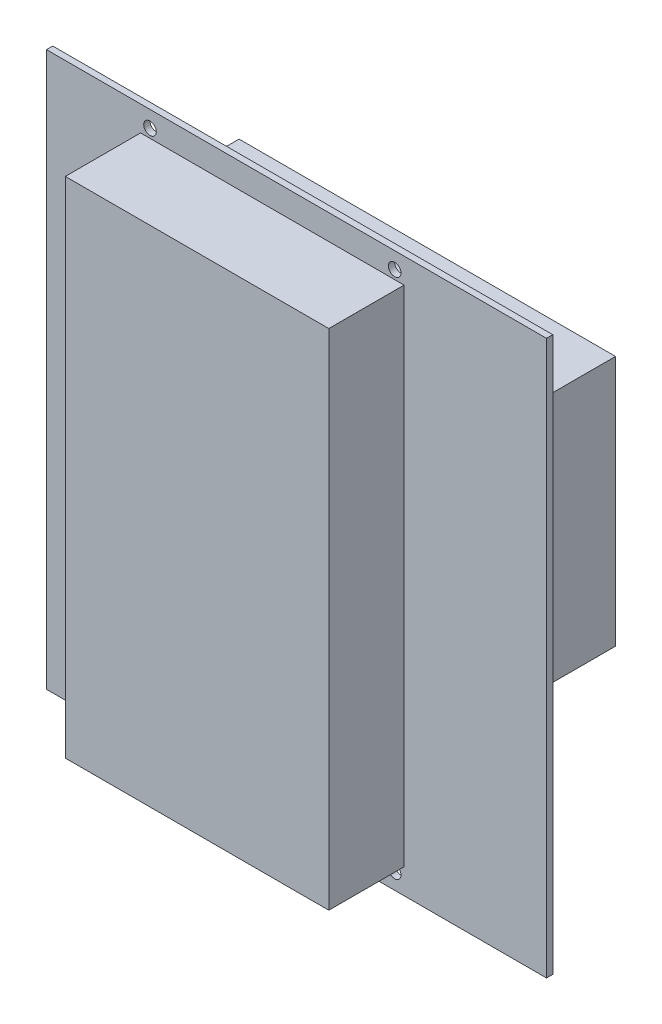
ISO-10303-21;
HEADER;
FILE_DESCRIPTION(('STEP AP214'),'2;1');
FILE_NAME('part.step','',(''),(''),'','','');
FILE_SCHEMA(('AUTOMOTIVE_DESIGN { 1 0 10303 214 1 1 1 1 }'));
ENDSEC;
DATA;
#1=APPLICATION_CONTEXT('core data for automotive mechanical design processes');
#2=APPLICATION_PROTOCOL_DEFINITION('international standard','automotive_design',2000,#1);
#3=PRODUCT_CONTEXT('',#1,'mechanical');
#4=PRODUCT('Part','Part','',(#3));
#5=PRODUCT_RELATED_PRODUCT_CATEGORY('part','',(#4));
#6=PRODUCT_DEFINITION_FORMATION('','',#4);
#7=PRODUCT_DEFINITION_CONTEXT('part definition',#1,'design');
#8=PRODUCT_DEFINITION('design','',#6,#7);
#9=PRODUCT_DEFINITION_SHAPE('','',#8);
#10=(LENGTH_UNIT() NAMED_UNIT(*) SI_UNIT(.MILLI.,.METRE.));
#11=(NAMED_UNIT(*) PLANE_ANGLE_UNIT() SI_UNIT($,.RADIAN.));
#12=(NAMED_UNIT(*) SI_UNIT($,.STERADIAN.) SOLID_ANGLE_UNIT());
#13=UNCERTAINTY_MEASURE_WITH_UNIT(LENGTH_MEASURE(1.E-05),#10,'distance_accuracy_value','');
#14=(GEOMETRIC_REPRESENTATION_CONTEXT(3) GLOBAL_UNCERTAINTY_ASSIGNED_CONTEXT((#13)) GLOBAL_UNIT_ASSIGNED_CONTEXT((#10,
#11,#12)) REPRESENTATION_CONTEXT('',''));
#15=CARTESIAN_POINT('',(0.,0.,0.));
#16=DIRECTION('',(0.,0.,1.));
#17=DIRECTION('',(1.,0.,0.));
#18=AXIS2_PLACEMENT_3D('',#15,#16,#17);
#19=CARTESIAN_POINT('',(0.,0.,0.));
#20=DIRECTION('',(0.,0.,-1.));
#21=DIRECTION('',(-1.,0.,0.));
#22=AXIS2_PLACEMENT_3D('',#19,#20,#21);
#23=PLANE('',#22);
#24=CARTESIAN_POINT('',(19.8755,-52.7685,0.));
#25=DIRECTION('',(0.,0.,-1.));
#26=DIRECTION('',(-1.,0.,0.));
#27=AXIS2_PLACEMENT_3D('',#24,#25,#26);
#28=CIRCLE('',#27,1.27);
#29=CARTESIAN_POINT('',(18.6055,-52.7685,0.));
#30=VERTEX_POINT('',#29);
#31=EDGE_CURVE('E221',#30,#30,#28,.T.);
#32=ORIENTED_EDGE('',*,*,#31,.F.);
#33=EDGE_LOOP('',(#32));
#34=FACE_BOUND('',#33,.T.);
#35=CARTESIAN_POINT('',(-29.6545,-52.7685,0.));
#36=DIRECTION('',(0.,0.,-1.));
#37=DIRECTION('',(-1.,0.,0.));
#38=AXIS2_PLACEMENT_3D('',#35,#36,#37);
#39=CIRCLE('',#38,1.27);
#40=CARTESIAN_POINT('',(-30.9245,-52.7685,0.));
#41=VERTEX_POINT('',#40);
#42=EDGE_CURVE('E218',#41,#41,#39,.T.);
#43=ORIENTED_EDGE('',*,*,#42,.F.);
#44=EDGE_LOOP('',(#43));
#45=FACE_BOUND('',#44,.T.);
#46=CARTESIAN_POINT('',(19.8755,52.7685,0.));
#47=DIRECTION('',(0.,0.,-1.));
#48=DIRECTION('',(-1.,0.,0.));
#49=AXIS2_PLACEMENT_3D('',#46,#47,#48);
#50=CIRCLE('',#49,1.27);
#51=CARTESIAN_POINT('',(18.6055,52.7685,0.));
#52=VERTEX_POINT('',#51);
#53=EDGE_CURVE('E215',#52,#52,#50,.T.);
#54=ORIENTED_EDGE('',*,*,#53,.F.);
#55=EDGE_LOOP('',(#54));
#56=FACE_BOUND('',#55,.T.);
#57=CARTESIAN_POINT('',(-29.6545,52.7685,0.));
#58=DIRECTION('',(0.,0.,-1.));
#59=DIRECTION('',(-1.,0.,0.));
#60=AXIS2_PLACEMENT_3D('',#57,#58,#59);
#61=CIRCLE('',#60,1.27);
#62=CARTESIAN_POINT('',(-30.9245,52.7685,0.));
#63=VERTEX_POINT('',#62);
#64=EDGE_CURVE('E214',#63,#63,#61,.T.);
#65=ORIENTED_EDGE('',*,*,#64,.F.);
#66=EDGE_LOOP('',(#65));
#67=FACE_BOUND('',#66,.T.);
#68=DIRECTION('',(0.,1.,0.));
#69=VECTOR('',#68,1.);
#70=CARTESIAN_POINT('',(-50.6095,-56.0705,0.));
#71=LINE('',#70,#69);
#72=CARTESIAN_POINT('',(-50.6095,-56.0705,0.));
#73=VERTEX_POINT('',#72);
#74=CARTESIAN_POINT('',(-50.6095,56.0705,0.));
#75=VERTEX_POINT('',#74);
#76=EDGE_CURVE('E182',#73,#75,#71,.T.);
#77=ORIENTED_EDGE('',*,*,#76,.T.);
#78=DIRECTION('',(1.,0.,0.));
#79=VECTOR('',#78,1.);
#80=CARTESIAN_POINT('',(-50.6095,56.0705,0.));
#81=LINE('',#80,#79);
#82=CARTESIAN_POINT('',(50.6095,56.0705,0.));
#83=VERTEX_POINT('',#82);
#84=EDGE_CURVE('E199',#75,#83,#81,.T.);
#85=ORIENTED_EDGE('',*,*,#84,.T.);
#86=DIRECTION('',(0.,-1.,0.));
#87=VECTOR('',#86,1.);
#88=CARTESIAN_POINT('',(50.6095,56.0705,0.));
#89=LINE('',#88,#87);
#90=CARTESIAN_POINT('',(50.6095,-56.0705,0.));
#91=VERTEX_POINT('',#90);
#92=EDGE_CURVE('E202',#83,#91,#89,.T.);
#93=ORIENTED_EDGE('',*,*,#92,.T.);
#94=DIRECTION('',(-1.,0.,0.));
#95=VECTOR('',#94,1.);
#96=CARTESIAN_POINT('',(50.6095,-56.0705,0.));
#97=LINE('',#96,#95);
#98=EDGE_CURVE('E187',#91,#73,#97,.T.);
#99=ORIENTED_EDGE('',*,*,#98,.T.);
#100=EDGE_LOOP('',(#77,#85,#93,#99));
#101=FACE_BOUND('',#100,.T.);
#102=DIRECTION('',(-1.,0.,0.));
#103=VECTOR('',#102,1.);
#104=CARTESIAN_POINT('',(41.7195,-13.7795,0.));
#105=LINE('',#104,#103);
#106=CARTESIAN_POINT('',(41.7195,-13.7795,0.));
#107=VERTEX_POINT('',#106);
#108=CARTESIAN_POINT('',(-34.4805,-13.7795,0.));
#109=VERTEX_POINT('',#108);
#110=EDGE_CURVE('E240',#107,#109,#105,.T.);
#111=ORIENTED_EDGE('',*,*,#110,.F.);
#112=DIRECTION('',(0.,-1.,0.));
#113=VECTOR('',#112,1.);
#114=CARTESIAN_POINT('',(41.7195,37.0205,0.));
#115=LINE('',#114,#113);
#116=CARTESIAN_POINT('',(41.7195,37.0205,0.));
#117=VERTEX_POINT('',#116);
#118=EDGE_CURVE('E146',#117,#107,#115,.T.);
#119=ORIENTED_EDGE('',*,*,#118,.F.);
#120=DIRECTION('',(1.,0.,0.));
#121=VECTOR('',#120,1.);
#122=CARTESIAN_POINT('',(41.7195,37.0205,0.));
#123=LINE('',#122,#121);
#124=CARTESIAN_POINT('',(-34.4805,37.0205,0.));
#125=VERTEX_POINT('',#124);
#126=EDGE_CURVE('E142',#125,#117,#123,.T.);
#127=ORIENTED_EDGE('',*,*,#126,.F.);
#128=DIRECTION('',(0.,1.,0.));
#129=VECTOR('',#128,1.);
#130=CARTESIAN_POINT('',(-34.4805,37.0205,0.));
#131=LINE('',#130,#129);
#132=EDGE_CURVE('E242',#109,#125,#131,.T.);
#133=ORIENTED_EDGE('',*,*,#132,.F.);
#134=EDGE_LOOP('',(#111,#119,#127,#133));
#135=FACE_BOUND('',#134,.T.);
#136=ADVANCED_FACE('F33',(#34,#45,#56,#67,#101,#135),#23,.T.);
#137=CARTESIAN_POINT('',(0.,0.,1.27));
#138=DIRECTION('',(0.,0.,-1.));
#139=DIRECTION('',(-1.,0.,0.));
#140=AXIS2_PLACEMENT_3D('',#137,#138,#139);
#141=PLANE('',#140);
#142=CARTESIAN_POINT('',(19.8755,-52.7685,1.27));
#143=DIRECTION('',(0.,0.,-1.));
#144=DIRECTION('',(-1.,0.,0.));
#145=AXIS2_PLACEMENT_3D('',#142,#143,#144);
#146=CIRCLE('',#145,1.27);
#147=CARTESIAN_POINT('',(18.6055,-52.7685,1.27));
#148=VERTEX_POINT('',#147);
#149=EDGE_CURVE('E37',#148,#148,#146,.T.);
#150=ORIENTED_EDGE('',*,*,#149,.T.);
#151=EDGE_LOOP('',(#150));
#152=FACE_BOUND('',#151,.T.);
#153=CARTESIAN_POINT('',(-29.6545,-52.7685,1.27));
#154=DIRECTION('',(0.,0.,-1.));
#155=DIRECTION('',(-1.,0.,0.));
#156=AXIS2_PLACEMENT_3D('',#153,#154,#155);
#157=CIRCLE('',#156,1.27);
#158=CARTESIAN_POINT('',(-30.9245,-52.7685,1.27));
#159=VERTEX_POINT('',#158);
#160=EDGE_CURVE('E219',#159,#159,#157,.T.);
#161=ORIENTED_EDGE('',*,*,#160,.T.);
#162=EDGE_LOOP('',(#161));
#163=FACE_BOUND('',#162,.T.);
#164=CARTESIAN_POINT('',(19.8755,52.7685,1.27));
#165=DIRECTION('',(0.,0.,-1.));
#166=DIRECTION('',(-1.,0.,0.));
#167=AXIS2_PLACEMENT_3D('',#164,#165,#166);
#168=CIRCLE('',#167,1.27);
#169=CARTESIAN_POINT('',(18.6055,52.7685,1.27));
#170=VERTEX_POINT('',#169);
#171=EDGE_CURVE('E216',#170,#170,#168,.T.);
#172=ORIENTED_EDGE('',*,*,#171,.T.);
#173=EDGE_LOOP('',(#172));
#174=FACE_BOUND('',#173,.T.);
#175=CARTESIAN_POINT('',(-29.6545,52.7685,1.27));
#176=DIRECTION('',(0.,0.,-1.));
#177=DIRECTION('',(-1.,0.,0.));
#178=AXIS2_PLACEMENT_3D('',#175,#176,#177);
#179=CIRCLE('',#178,1.27);
#180=CARTESIAN_POINT('',(-30.9245,52.7685,1.27));
#181=VERTEX_POINT('',#180);
#182=EDGE_CURVE('E211',#181,#181,#179,.T.);
#183=ORIENTED_EDGE('',*,*,#182,.T.);
#184=EDGE_LOOP('',(#183));
#185=FACE_BOUND('',#184,.T.);
#186=DIRECTION('',(0.,1.,0.));
#187=VECTOR('',#186,1.);
#188=CARTESIAN_POINT('',(-50.6095,-56.0705,1.27));
#189=LINE('',#188,#187);
#190=CARTESIAN_POINT('',(-50.6095,-56.0705,1.27));
#191=VERTEX_POINT('',#190);
#192=CARTESIAN_POINT('',(-50.6095,56.0705,1.27));
#193=VERTEX_POINT('',#192);
#194=EDGE_CURVE('E183',#191,#193,#189,.T.);
#195=ORIENTED_EDGE('',*,*,#194,.F.);
#196=DIRECTION('',(-1.,0.,0.));
#197=VECTOR('',#196,1.);
#198=CARTESIAN_POINT('',(50.6095,-56.0705,1.27));
#199=LINE('',#198,#197);
#200=CARTESIAN_POINT('',(50.6095,-56.0705,1.27));
#201=VERTEX_POINT('',#200);
#202=EDGE_CURVE('E193',#201,#191,#199,.T.);
#203=ORIENTED_EDGE('',*,*,#202,.F.);
#204=DIRECTION('',(0.,-1.,0.));
#205=VECTOR('',#204,1.);
#206=CARTESIAN_POINT('',(50.6095,56.0705,1.27));
#207=LINE('',#206,#205);
#208=CARTESIAN_POINT('',(50.6095,56.0705,1.27));
#209=VERTEX_POINT('',#208);
#210=EDGE_CURVE('E190',#209,#201,#207,.T.);
#211=ORIENTED_EDGE('',*,*,#210,.F.);
#212=DIRECTION('',(1.,0.,0.));
#213=VECTOR('',#212,1.);
#214=CARTESIAN_POINT('',(-50.6095,56.0705,1.27));
#215=LINE('',#214,#213);
#216=EDGE_CURVE('E186',#193,#209,#215,.T.);
#217=ORIENTED_EDGE('',*,*,#216,.F.);
#218=EDGE_LOOP('',(#195,#203,#211,#217));
#219=FACE_BOUND('',#218,.T.);
#220=DIRECTION('',(0.,-1.,0.));
#221=VECTOR('',#220,1.);
#222=CARTESIAN_POINT('',(-31.5595,-50.9905,1.27));
#223=LINE('',#222,#221);
#224=CARTESIAN_POINT('',(-31.5595,50.9905,1.27));
#225=VERTEX_POINT('',#224);
#226=CARTESIAN_POINT('',(-31.5595,-50.9905,1.27));
#227=VERTEX_POINT('',#226);
#228=EDGE_CURVE('E148',#225,#227,#223,.T.);
#229=ORIENTED_EDGE('',*,*,#228,.F.);
#230=DIRECTION('',(-1.,0.,0.));
#231=VECTOR('',#230,1.);
#232=CARTESIAN_POINT('',(-31.5595,50.9905,1.27));
#233=LINE('',#232,#231);
#234=CARTESIAN_POINT('',(21.7805,50.9905,1.27));
#235=VERTEX_POINT('',#234);
#236=EDGE_CURVE('E159',#235,#225,#233,.T.);
#237=ORIENTED_EDGE('',*,*,#236,.F.);
#238=DIRECTION('',(0.,1.,0.));
#239=VECTOR('',#238,1.);
#240=CARTESIAN_POINT('',(21.7805,50.9905,1.27));
#241=LINE('',#240,#239);
#242=CARTESIAN_POINT('',(21.7805,-50.9905,1.27));
#243=VERTEX_POINT('',#242);
#244=EDGE_CURVE('E167',#243,#235,#241,.T.);
#245=ORIENTED_EDGE('',*,*,#244,.F.);
#246=DIRECTION('',(1.,0.,0.));
#247=VECTOR('',#246,1.);
#248=CARTESIAN_POINT('',(21.7805,-50.9905,1.27));
#249=LINE('',#248,#247);
#250=EDGE_CURVE('E58',#227,#243,#249,.T.);
#251=ORIENTED_EDGE('',*,*,#250,.F.);
#252=EDGE_LOOP('',(#229,#237,#245,#251));
#253=FACE_BOUND('',#252,.T.);
#254=ADVANCED_FACE('F261',(#152,#163,#174,#185,#219,#253),#141,.F.);
#255=CARTESIAN_POINT('',(-50.6095,-56.0705,1.27));
#256=DIRECTION('',(-1.,0.,0.));
#257=DIRECTION('',(0.,0.,1.));
#258=AXIS2_PLACEMENT_3D('',#255,#256,#257);
#259=PLANE('',#258);
#260=ORIENTED_EDGE('',*,*,#76,.F.);
#261=DIRECTION('',(0.,0.,-1.));
#262=VECTOR('',#261,1.);
#263=CARTESIAN_POINT('',(-50.6095,-56.0705,1.27));
#264=LINE('',#263,#262);
#265=EDGE_CURVE('E11',#191,#73,#264,.T.);
#266=ORIENTED_EDGE('',*,*,#265,.F.);
#267=ORIENTED_EDGE('',*,*,#194,.T.);
#268=DIRECTION('',(0.,0.,-1.));
#269=VECTOR('',#268,1.);
#270=CARTESIAN_POINT('',(-50.6095,56.0705,1.27));
#271=LINE('',#270,#269);
#272=EDGE_CURVE('E196',#193,#75,#271,.T.);
#273=ORIENTED_EDGE('',*,*,#272,.T.);
#274=EDGE_LOOP('',(#260,#266,#267,#273));
#275=FACE_BOUND('',#274,.T.);
#276=ADVANCED_FACE('F35',(#275),#259,.T.);
#277=CARTESIAN_POINT('',(50.6095,-56.0705,1.27));
#278=DIRECTION('',(0.,-1.,0.));
#279=DIRECTION('',(1.,0.,0.));
#280=AXIS2_PLACEMENT_3D('',#277,#278,#279);
#281=PLANE('',#280);
#282=ORIENTED_EDGE('',*,*,#98,.F.);
#283=DIRECTION('',(0.,0.,-1.));
#284=VECTOR('',#283,1.);
#285=CARTESIAN_POINT('',(50.6095,-56.0705,1.27));
#286=LINE('',#285,#284);
#287=EDGE_CURVE('E42',#201,#91,#286,.T.);
#288=ORIENTED_EDGE('',*,*,#287,.F.);
#289=ORIENTED_EDGE('',*,*,#202,.T.);
#290=ORIENTED_EDGE('',*,*,#265,.T.);
#291=EDGE_LOOP('',(#282,#288,#289,#290));
#292=FACE_BOUND('',#291,.T.);
#293=ADVANCED_FACE('F272',(#292),#281,.T.);
#294=CARTESIAN_POINT('',(50.6095,56.0705,1.27));
#295=DIRECTION('',(1.,0.,0.));
#296=DIRECTION('',(0.,1.,0.));
#297=AXIS2_PLACEMENT_3D('',#294,#295,#296);
#298=PLANE('',#297);
#299=ORIENTED_EDGE('',*,*,#92,.F.);
#300=DIRECTION('',(0.,0.,-1.));
#301=VECTOR('',#300,1.);
#302=CARTESIAN_POINT('',(50.6095,56.0705,1.27));
#303=LINE('',#302,#301);
#304=EDGE_CURVE('E208',#209,#83,#303,.T.);
#305=ORIENTED_EDGE('',*,*,#304,.F.);
#306=ORIENTED_EDGE('',*,*,#210,.T.);
#307=ORIENTED_EDGE('',*,*,#287,.T.);
#308=EDGE_LOOP('',(#299,#305,#306,#307));
#309=FACE_BOUND('',#308,.T.);
#310=ADVANCED_FACE('F275',(#309),#298,.T.);
#311=CARTESIAN_POINT('',(-50.6095,56.0705,1.27));
#312=DIRECTION('',(0.,1.,0.));
#313=DIRECTION('',(-1.,0.,0.));
#314=AXIS2_PLACEMENT_3D('',#311,#312,#313);
#315=PLANE('',#314);
#316=ORIENTED_EDGE('',*,*,#84,.F.);
#317=ORIENTED_EDGE('',*,*,#272,.F.);
#318=ORIENTED_EDGE('',*,*,#216,.T.);
#319=ORIENTED_EDGE('',*,*,#304,.T.);
#320=EDGE_LOOP('',(#316,#317,#318,#319));
#321=FACE_BOUND('',#320,.T.);
#322=ADVANCED_FACE('F278',(#321),#315,.T.);
#323=CARTESIAN_POINT('',(-31.5595,-50.9905,16.51));
#324=DIRECTION('',(1.,0.,0.));
#325=DIRECTION('',(0.,0.,-1.));
#326=AXIS2_PLACEMENT_3D('',#323,#324,#325);
#327=PLANE('',#326);
#328=ORIENTED_EDGE('',*,*,#228,.T.);
#329=DIRECTION('',(0.,0.,-1.));
#330=VECTOR('',#329,1.);
#331=CARTESIAN_POINT('',(-31.5595,-50.9905,16.51));
#332=LINE('',#331,#330);
#333=CARTESIAN_POINT('',(-31.5595,-50.9905,16.51));
#334=VERTEX_POINT('',#333);
#335=EDGE_CURVE('E180',#334,#227,#332,.T.);
#336=ORIENTED_EDGE('',*,*,#335,.F.);
#337=DIRECTION('',(0.,-1.,0.));
#338=VECTOR('',#337,1.);
#339=CARTESIAN_POINT('',(-31.5595,-50.9905,16.51));
#340=LINE('',#339,#338);
#341=CARTESIAN_POINT('',(-31.5595,50.9905,16.51));
#342=VERTEX_POINT('',#341);
#343=EDGE_CURVE('E155',#342,#334,#340,.T.);
#344=ORIENTED_EDGE('',*,*,#343,.F.);
#345=DIRECTION('',(0.,0.,-1.));
#346=VECTOR('',#345,1.);
#347=CARTESIAN_POINT('',(-31.5595,50.9905,16.51));
#348=LINE('',#347,#346);
#349=EDGE_CURVE('E164',#342,#225,#348,.T.);
#350=ORIENTED_EDGE('',*,*,#349,.T.);
#351=EDGE_LOOP('',(#328,#336,#344,#350));
#352=FACE_BOUND('',#351,.T.);
#353=ADVANCED_FACE('F281',(#352),#327,.F.);
#354=CARTESIAN_POINT('',(21.7805,-50.9905,16.51));
#355=DIRECTION('',(0.,1.,0.));
#356=DIRECTION('',(0.,0.,1.));
#357=AXIS2_PLACEMENT_3D('',#354,#355,#356);
#358=PLANE('',#357);
#359=ORIENTED_EDGE('',*,*,#250,.T.);
#360=DIRECTION('',(0.,0.,-1.));
#361=VECTOR('',#360,1.);
#362=CARTESIAN_POINT('',(21.7805,-50.9905,16.51));
#363=LINE('',#362,#361);
#364=CARTESIAN_POINT('',(21.7805,-50.9905,16.51));
#365=VERTEX_POINT('',#364);
#366=EDGE_CURVE('E177',#365,#243,#363,.T.);
#367=ORIENTED_EDGE('',*,*,#366,.F.);
#368=DIRECTION('',(1.,0.,0.));
#369=VECTOR('',#368,1.);
#370=CARTESIAN_POINT('',(21.7805,-50.9905,16.51));
#371=LINE('',#370,#369);
#372=EDGE_CURVE('E158',#334,#365,#371,.T.);
#373=ORIENTED_EDGE('',*,*,#372,.F.);
#374=ORIENTED_EDGE('',*,*,#335,.T.);
#375=EDGE_LOOP('',(#359,#367,#373,#374));
#376=FACE_BOUND('',#375,.T.);
#377=ADVANCED_FACE('F286',(#376),#358,.F.);
#378=CARTESIAN_POINT('',(21.7805,50.9905,16.51));
#379=DIRECTION('',(-1.,0.,0.));
#380=DIRECTION('',(0.,-1.,0.));
#381=AXIS2_PLACEMENT_3D('',#378,#379,#380);
#382=PLANE('',#381);
#383=ORIENTED_EDGE('',*,*,#244,.T.);
#384=DIRECTION('',(0.,0.,-1.));
#385=VECTOR('',#384,1.);
#386=CARTESIAN_POINT('',(21.7805,50.9905,16.51));
#387=LINE('',#386,#385);
#388=CARTESIAN_POINT('',(21.7805,50.9905,16.51));
#389=VERTEX_POINT('',#388);
#390=EDGE_CURVE('E174',#389,#235,#387,.T.);
#391=ORIENTED_EDGE('',*,*,#390,.F.);
#392=DIRECTION('',(0.,1.,0.));
#393=VECTOR('',#392,1.);
#394=CARTESIAN_POINT('',(21.7805,50.9905,16.51));
#395=LINE('',#394,#393);
#396=EDGE_CURVE('E161',#365,#389,#395,.T.);
#397=ORIENTED_EDGE('',*,*,#396,.F.);
#398=ORIENTED_EDGE('',*,*,#366,.T.);
#399=EDGE_LOOP('',(#383,#391,#397,#398));
#400=FACE_BOUND('',#399,.T.);
#401=ADVANCED_FACE('F311',(#400),#382,.F.);
#402=CARTESIAN_POINT('',(-31.5595,50.9905,16.51));
#403=DIRECTION('',(0.,-1.,0.));
#404=DIRECTION('',(0.,0.,-1.));
#405=AXIS2_PLACEMENT_3D('',#402,#403,#404);
#406=PLANE('',#405);
#407=ORIENTED_EDGE('',*,*,#236,.T.);
#408=ORIENTED_EDGE('',*,*,#349,.F.);
#409=DIRECTION('',(-1.,0.,0.));
#410=VECTOR('',#409,1.);
#411=CARTESIAN_POINT('',(-31.5595,50.9905,16.51));
#412=LINE('',#411,#410);
#413=EDGE_CURVE('E163',#389,#342,#412,.T.);
#414=ORIENTED_EDGE('',*,*,#413,.F.);
#415=ORIENTED_EDGE('',*,*,#390,.T.);
#416=EDGE_LOOP('',(#407,#408,#414,#415));
#417=FACE_BOUND('',#416,.T.);
#418=ADVANCED_FACE('F302',(#417),#406,.F.);
#419=CARTESIAN_POINT('',(0.,0.,16.51));
#420=DIRECTION('',(0.,0.,-1.));
#421=DIRECTION('',(-1.,0.,0.));
#422=AXIS2_PLACEMENT_3D('',#419,#420,#421);
#423=PLANE('',#422);
#424=ORIENTED_EDGE('',*,*,#343,.T.);
#425=ORIENTED_EDGE('',*,*,#372,.T.);
#426=ORIENTED_EDGE('',*,*,#396,.T.);
#427=ORIENTED_EDGE('',*,*,#413,.T.);
#428=EDGE_LOOP('',(#424,#425,#426,#427));
#429=FACE_BOUND('',#428,.T.);
#430=ADVANCED_FACE('F307',(#429),#423,.F.);
#431=CARTESIAN_POINT('',(41.7195,37.0205,-21.59));
#432=DIRECTION('',(-1.,0.,0.));
#433=DIRECTION('',(0.,-1.,0.));
#434=AXIS2_PLACEMENT_3D('',#431,#432,#433);
#435=PLANE('',#434);
#436=ORIENTED_EDGE('',*,*,#118,.T.);
#437=DIRECTION('',(0.,0.,1.));
#438=VECTOR('',#437,1.);
#439=CARTESIAN_POINT('',(41.7195,-13.7795,-21.59));
#440=LINE('',#439,#438);
#441=CARTESIAN_POINT('',(41.7195,-13.7795,-21.59));
#442=VERTEX_POINT('',#441);
#443=EDGE_CURVE('E127',#442,#107,#440,.T.);
#444=ORIENTED_EDGE('',*,*,#443,.F.);
#445=DIRECTION('',(0.,-1.,0.));
#446=VECTOR('',#445,1.);
#447=CARTESIAN_POINT('',(41.7195,37.0205,-21.59));
#448=LINE('',#447,#446);
#449=CARTESIAN_POINT('',(41.7195,37.0205,-21.59));
#450=VERTEX_POINT('',#449);
#451=EDGE_CURVE('E134',#450,#442,#448,.T.);
#452=ORIENTED_EDGE('',*,*,#451,.F.);
#453=DIRECTION('',(0.,0.,1.));
#454=VECTOR('',#453,1.);
#455=CARTESIAN_POINT('',(41.7195,37.0205,-21.59));
#456=LINE('',#455,#454);
#457=EDGE_CURVE('E238',#450,#117,#456,.T.);
#458=ORIENTED_EDGE('',*,*,#457,.T.);
#459=EDGE_LOOP('',(#436,#444,#452,#458));
#460=FACE_BOUND('',#459,.T.);
#461=ADVANCED_FACE('F144',(#460),#435,.F.);
#462=CARTESIAN_POINT('',(41.7195,-13.7795,-21.59));
#463=DIRECTION('',(0.,1.,0.));
#464=DIRECTION('',(0.,0.,1.));
#465=AXIS2_PLACEMENT_3D('',#462,#463,#464);
#466=PLANE('',#465);
#467=ORIENTED_EDGE('',*,*,#110,.T.);
#468=DIRECTION('',(0.,0.,1.));
#469=VECTOR('',#468,1.);
#470=CARTESIAN_POINT('',(-34.4805,-13.7795,-21.59));
#471=LINE('',#470,#469);
#472=CARTESIAN_POINT('',(-34.4805,-13.7795,-21.59));
#473=VERTEX_POINT('',#472);
#474=EDGE_CURVE('E130',#473,#109,#471,.T.);
#475=ORIENTED_EDGE('',*,*,#474,.F.);
#476=DIRECTION('',(-1.,0.,0.));
#477=VECTOR('',#476,1.);
#478=CARTESIAN_POINT('',(41.7195,-13.7795,-21.59));
#479=LINE('',#478,#477);
#480=EDGE_CURVE('E123',#442,#473,#479,.T.);
#481=ORIENTED_EDGE('',*,*,#480,.F.);
#482=ORIENTED_EDGE('',*,*,#443,.T.);
#483=EDGE_LOOP('',(#467,#475,#481,#482));
#484=FACE_BOUND('',#483,.T.);
#485=ADVANCED_FACE('F125',(#484),#466,.F.);
#486=CARTESIAN_POINT('',(-34.4805,37.0205,-21.59));
#487=DIRECTION('',(1.,0.,0.));
#488=DIRECTION('',(0.,0.,-1.));
#489=AXIS2_PLACEMENT_3D('',#486,#487,#488);
#490=PLANE('',#489);
#491=ORIENTED_EDGE('',*,*,#132,.T.);
#492=DIRECTION('',(0.,0.,1.));
#493=VECTOR('',#492,1.);
#494=CARTESIAN_POINT('',(-34.4805,37.0205,-21.59));
#495=LINE('',#494,#493);
#496=CARTESIAN_POINT('',(-34.4805,37.0205,-21.59));
#497=VERTEX_POINT('',#496);
#498=EDGE_CURVE('E50',#497,#125,#495,.T.);
#499=ORIENTED_EDGE('',*,*,#498,.F.);
#500=DIRECTION('',(0.,1.,0.));
#501=VECTOR('',#500,1.);
#502=CARTESIAN_POINT('',(-34.4805,37.0205,-21.59));
#503=LINE('',#502,#501);
#504=EDGE_CURVE('E133',#473,#497,#503,.T.);
#505=ORIENTED_EDGE('',*,*,#504,.F.);
#506=ORIENTED_EDGE('',*,*,#474,.T.);
#507=EDGE_LOOP('',(#491,#499,#505,#506));
#508=FACE_BOUND('',#507,.T.);
#509=ADVANCED_FACE('F249',(#508),#490,.F.);
#510=CARTESIAN_POINT('',(41.7195,37.0205,-21.59));
#511=DIRECTION('',(0.,-1.,0.));
#512=DIRECTION('',(0.,0.,-1.));
#513=AXIS2_PLACEMENT_3D('',#510,#511,#512);
#514=PLANE('',#513);
#515=ORIENTED_EDGE('',*,*,#126,.T.);
#516=ORIENTED_EDGE('',*,*,#457,.F.);
#517=DIRECTION('',(1.,0.,0.));
#518=VECTOR('',#517,1.);
#519=CARTESIAN_POINT('',(41.7195,37.0205,-21.59));
#520=LINE('',#519,#518);
#521=EDGE_CURVE('E138',#497,#450,#520,.T.);
#522=ORIENTED_EDGE('',*,*,#521,.F.);
#523=ORIENTED_EDGE('',*,*,#498,.T.);
#524=EDGE_LOOP('',(#515,#516,#522,#523));
#525=FACE_BOUND('',#524,.T.);
#526=ADVANCED_FACE('F250',(#525),#514,.F.);
#527=CARTESIAN_POINT('',(0.,0.,-21.59));
#528=DIRECTION('',(0.,0.,-1.));
#529=DIRECTION('',(-1.,0.,0.));
#530=AXIS2_PLACEMENT_3D('',#527,#528,#529);
#531=PLANE('',#530);
#532=ORIENTED_EDGE('',*,*,#451,.T.);
#533=ORIENTED_EDGE('',*,*,#480,.T.);
#534=ORIENTED_EDGE('',*,*,#504,.T.);
#535=ORIENTED_EDGE('',*,*,#521,.T.);
#536=EDGE_LOOP('',(#532,#533,#534,#535));
#537=FACE_BOUND('',#536,.T.);
#538=ADVANCED_FACE('F137',(#537),#531,.T.);
#539=CARTESIAN_POINT('',(-29.6545,52.7685,-21.59));
#540=DIRECTION('',(0.,0.,1.));
#541=DIRECTION('',(1.,0.,0.));
#542=AXIS2_PLACEMENT_3D('',#539,#540,#541);
#543=CYLINDRICAL_SURFACE('',#542,1.27);
#544=ORIENTED_EDGE('',*,*,#64,.T.);
#545=EDGE_LOOP('',(#544));
#546=FACE_BOUND('',#545,.T.);
#547=ORIENTED_EDGE('',*,*,#182,.F.);
#548=EDGE_LOOP('',(#547));
#549=FACE_BOUND('',#548,.T.);
#550=ADVANCED_FACE('F257',(#546,#549),#543,.F.);
#551=CARTESIAN_POINT('',(19.8755,52.7685,-21.59));
#552=DIRECTION('',(0.,0.,1.));
#553=DIRECTION('',(1.,0.,0.));
#554=AXIS2_PLACEMENT_3D('',#551,#552,#553);
#555=CYLINDRICAL_SURFACE('',#554,1.27);
#556=ORIENTED_EDGE('',*,*,#53,.T.);
#557=EDGE_LOOP('',(#556));
#558=FACE_BOUND('',#557,.T.);
#559=ORIENTED_EDGE('',*,*,#171,.F.);
#560=EDGE_LOOP('',(#559));
#561=FACE_BOUND('',#560,.T.);
#562=ADVANCED_FACE('F369',(#558,#561),#555,.F.);
#563=CARTESIAN_POINT('',(-29.6545,-52.7685,-21.59));
#564=DIRECTION('',(0.,0.,1.));
#565=DIRECTION('',(1.,0.,0.));
#566=AXIS2_PLACEMENT_3D('',#563,#564,#565);
#567=CYLINDRICAL_SURFACE('',#566,1.27);
#568=ORIENTED_EDGE('',*,*,#42,.T.);
#569=EDGE_LOOP('',(#568));
#570=FACE_BOUND('',#569,.T.);
#571=ORIENTED_EDGE('',*,*,#160,.F.);
#572=EDGE_LOOP('',(#571));
#573=FACE_BOUND('',#572,.T.);
#574=ADVANCED_FACE('F379',(#570,#573),#567,.F.);
#575=CARTESIAN_POINT('',(19.8755,-52.7685,-21.59));
#576=DIRECTION('',(0.,0.,1.));
#577=DIRECTION('',(1.,0.,0.));
#578=AXIS2_PLACEMENT_3D('',#575,#576,#577);
#579=CYLINDRICAL_SURFACE('',#578,1.27);
#580=ORIENTED_EDGE('',*,*,#31,.T.);
#581=EDGE_LOOP('',(#580));
#582=FACE_BOUND('',#581,.T.);
#583=ORIENTED_EDGE('',*,*,#149,.F.);
#584=EDGE_LOOP('',(#583));
#585=FACE_BOUND('',#584,.T.);
#586=ADVANCED_FACE('F389',(#582,#585),#579,.F.);
#587=CLOSED_SHELL('',(#136,#254,#276,#293,#310,#322,#353,#377,#401,#418,#430,#461,#485,#509,
#526,#538,#550,#562,#574,#586));
#588=MANIFOLD_SOLID_BREP('B2',#587);
#589=ADVANCED_BREP_SHAPE_REPRESENTATION('',(#18,#588),#14);
#590=SHAPE_DEFINITION_REPRESENTATION(#9,#589);
ENDSEC;
END-ISO-10303-21;
